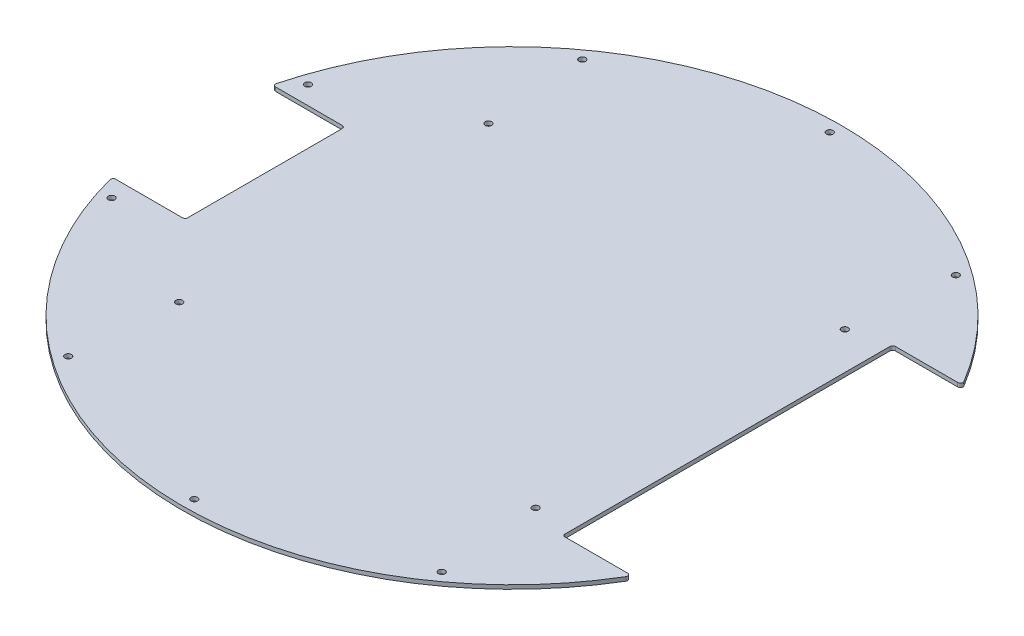
ISO-10303-21;
HEADER;
FILE_DESCRIPTION(('STEP AP214'),'2;1');
FILE_NAME('part.step','',(''),(''),'','','');
FILE_SCHEMA(('AUTOMOTIVE_DESIGN { 1 0 10303 214 1 1 1 1 }'));
ENDSEC;
DATA;
#1=APPLICATION_CONTEXT('core data for automotive mechanical design processes');
#2=APPLICATION_PROTOCOL_DEFINITION('international standard','automotive_design',2000,#1);
#3=PRODUCT_CONTEXT('',#1,'mechanical');
#4=PRODUCT('Part','Part','',(#3));
#5=PRODUCT_RELATED_PRODUCT_CATEGORY('part','',(#4));
#6=PRODUCT_DEFINITION_FORMATION('','',#4);
#7=PRODUCT_DEFINITION_CONTEXT('part definition',#1,'design');
#8=PRODUCT_DEFINITION('design','',#6,#7);
#9=PRODUCT_DEFINITION_SHAPE('','',#8);
#10=(LENGTH_UNIT() NAMED_UNIT(*) SI_UNIT(.MILLI.,.METRE.));
#11=(NAMED_UNIT(*) PLANE_ANGLE_UNIT() SI_UNIT($,.RADIAN.));
#12=(NAMED_UNIT(*) SI_UNIT($,.STERADIAN.) SOLID_ANGLE_UNIT());
#13=UNCERTAINTY_MEASURE_WITH_UNIT(LENGTH_MEASURE(1.E-05),#10,'distance_accuracy_value','');
#14=(GEOMETRIC_REPRESENTATION_CONTEXT(3) GLOBAL_UNCERTAINTY_ASSIGNED_CONTEXT((#13)) GLOBAL_UNIT_ASSIGNED_CONTEXT((#10,
#11,#12)) REPRESENTATION_CONTEXT('',''));
#15=CARTESIAN_POINT('',(0.,0.,0.));
#16=DIRECTION('',(0.,0.,1.));
#17=DIRECTION('',(1.,0.,0.));
#18=AXIS2_PLACEMENT_3D('',#15,#16,#17);
#19=CARTESIAN_POINT('',(0.,3.,0.));
#20=DIRECTION('',(0.,-1.,0.));
#21=DIRECTION('',(0.,0.,-1.));
#22=AXIS2_PLACEMENT_3D('',#19,#20,#21);
#23=CYLINDRICAL_SURFACE('',#22,251.5);
#24=CARTESIAN_POINT('',(0.,3.,0.));
#25=DIRECTION('',(0.,1.,0.));
#26=DIRECTION('',(0.,0.,1.));
#27=AXIS2_PLACEMENT_3D('',#24,#25,#26);
#28=CIRCLE('',#27,251.5);
#29=CARTESIAN_POINT('',(-243.350290121779,3.,63.5050100200451));
#30=VERTEX_POINT('',#29);
#31=CARTESIAN_POINT('',(215.880818690317,3.,129.026052104211));
#32=VERTEX_POINT('',#31);
#33=EDGE_CURVE('E151',#30,#32,#28,.T.);
#34=ORIENTED_EDGE('',*,*,#33,.F.);
#35=DIRECTION('',(0.,-1.,0.));
#36=VECTOR('',#35,1.);
#37=CARTESIAN_POINT('',(-243.350290121779,3.,63.5050100200451));
#38=LINE('',#37,#36);
#39=CARTESIAN_POINT('',(-243.350290121779,0.,63.5050100200451));
#40=VERTEX_POINT('',#39);
#41=EDGE_CURVE('E164',#30,#40,#38,.T.);
#42=ORIENTED_EDGE('',*,*,#41,.T.);
#43=CARTESIAN_POINT('',(0.,0.,0.));
#44=DIRECTION('',(0.,1.,0.));
#45=DIRECTION('',(0.,0.,1.));
#46=AXIS2_PLACEMENT_3D('',#43,#44,#45);
#47=CIRCLE('',#46,251.5);
#48=CARTESIAN_POINT('',(215.880818690317,0.,129.026052104211));
#49=VERTEX_POINT('',#48);
#50=EDGE_CURVE('E306',#40,#49,#47,.T.);
#51=ORIENTED_EDGE('',*,*,#50,.T.);
#52=DIRECTION('',(0.,-1.,0.));
#53=VECTOR('',#52,1.);
#54=CARTESIAN_POINT('',(215.880818690317,3.,129.026052104211));
#55=LINE('',#54,#53);
#56=EDGE_CURVE('E167',#49,#32,#55,.F.);
#57=ORIENTED_EDGE('',*,*,#56,.T.);
#58=EDGE_LOOP('',(#34,#42,#51,#57));
#59=FACE_BOUND('',#58,.T.);
#60=ADVANCED_FACE('F34',(#59),#23,.T.);
#61=CARTESIAN_POINT('',(215.880818690317,0.,-129.026052104211));
#62=VERTEX_POINT('',#61);
#63=CARTESIAN_POINT('',(-243.350290121782,0.,-63.5050100200349));
#64=VERTEX_POINT('',#63);
#65=EDGE_CURVE('E169',#62,#64,#47,.T.);
#66=ORIENTED_EDGE('',*,*,#65,.T.);
#67=DIRECTION('',(0.,-1.,0.));
#68=VECTOR('',#67,1.);
#69=CARTESIAN_POINT('',(-243.350290121782,3.,-63.5050100200349));
#70=LINE('',#69,#68);
#71=CARTESIAN_POINT('',(-243.350290121782,3.,-63.5050100200349));
#72=VERTEX_POINT('',#71);
#73=EDGE_CURVE('E196',#64,#72,#70,.F.);
#74=ORIENTED_EDGE('',*,*,#73,.T.);
#75=CARTESIAN_POINT('',(215.880818690317,3.,-129.026052104211));
#76=VERTEX_POINT('',#75);
#77=EDGE_CURVE('E168',#76,#72,#28,.T.);
#78=ORIENTED_EDGE('',*,*,#77,.F.);
#79=DIRECTION('',(0.,-1.,0.));
#80=VECTOR('',#79,1.);
#81=CARTESIAN_POINT('',(215.880818690317,3.,-129.026052104211));
#82=LINE('',#81,#80);
#83=EDGE_CURVE('E157',#76,#62,#82,.T.);
#84=ORIENTED_EDGE('',*,*,#83,.T.);
#85=EDGE_LOOP('',(#66,#74,#78,#84));
#86=FACE_BOUND('',#85,.T.);
#87=ADVANCED_FACE('F258',(#86),#23,.T.);
#88=CARTESIAN_POINT('',(0.,3.,0.));
#89=DIRECTION('',(0.,1.,0.));
#90=DIRECTION('',(0.,0.,1.));
#91=AXIS2_PLACEMENT_3D('',#88,#89,#90);
#92=PLANE('',#91);
#93=DIRECTION('',(1.,0.,0.));
#94=VECTOR('',#93,1.);
#95=CARTESIAN_POINT('',(-188.500000000003,3.,61.0000000000037));
#96=LINE('',#95,#94);
#97=CARTESIAN_POINT('',(-241.415098947848,3.,61.000000000005));
#98=VERTEX_POINT('',#97);
#99=CARTESIAN_POINT('',(-190.500000000003,3.,61.0000000000037));
#100=VERTEX_POINT('',#99);
#101=EDGE_CURVE('E153',#98,#100,#96,.T.);
#102=ORIENTED_EDGE('',*,*,#101,.F.);
#103=CARTESIAN_POINT('',(-241.415098947848,3.,63.000000000005));
#104=DIRECTION('',(0.,1.,0.));
#105=DIRECTION('',(0.,0.,1.));
#106=AXIS2_PLACEMENT_3D('',#103,#104,#105);
#107=CIRCLE('',#106,2.);
#108=EDGE_CURVE('E147',#98,#30,#107,.T.);
#109=ORIENTED_EDGE('',*,*,#108,.T.);
#110=ORIENTED_EDGE('',*,*,#33,.T.);
#111=CARTESIAN_POINT('',(214.164072617233,3.,128.000000000003));
#112=DIRECTION('',(0.,1.,0.));
#113=DIRECTION('',(0.,0.,1.));
#114=AXIS2_PLACEMENT_3D('',#111,#112,#113);
#115=CIRCLE('',#114,2.);
#116=CARTESIAN_POINT('',(214.164072617232,3.,126.000000000003));
#117=VERTEX_POINT('',#116);
#118=EDGE_CURVE('E191',#32,#117,#115,.T.);
#119=ORIENTED_EDGE('',*,*,#118,.T.);
#120=DIRECTION('',(1.,0.,0.));
#121=VECTOR('',#120,1.);
#122=CARTESIAN_POINT('',(164.499999999997,3.,126.000000000003));
#123=LINE('',#122,#121);
#124=CARTESIAN_POINT('',(166.499999999997,3.,126.000000000003));
#125=VERTEX_POINT('',#124);
#126=EDGE_CURVE('E367',#125,#117,#123,.T.);
#127=ORIENTED_EDGE('',*,*,#126,.F.);
#128=CARTESIAN_POINT('',(166.499999999997,3.,124.000000000003));
#129=DIRECTION('',(0.,1.,0.));
#130=DIRECTION('',(0.,0.,1.));
#131=AXIS2_PLACEMENT_3D('',#128,#129,#130);
#132=CIRCLE('',#131,2.);
#133=CARTESIAN_POINT('',(164.499999999997,3.,124.000000000003));
#134=VERTEX_POINT('',#133);
#135=EDGE_CURVE('E222',#125,#134,#132,.F.);
#136=ORIENTED_EDGE('',*,*,#135,.T.);
#137=DIRECTION('',(0.,0.,1.));
#138=VECTOR('',#137,1.);
#139=CARTESIAN_POINT('',(164.499999999997,3.,-126.000000000003));
#140=LINE('',#139,#138);
#141=CARTESIAN_POINT('',(164.499999999997,3.,-124.000000000003));
#142=VERTEX_POINT('',#141);
#143=EDGE_CURVE('E364',#142,#134,#140,.T.);
#144=ORIENTED_EDGE('',*,*,#143,.F.);
#145=CARTESIAN_POINT('',(166.499999999997,3.,-124.000000000003));
#146=DIRECTION('',(0.,1.,0.));
#147=DIRECTION('',(0.,0.,1.));
#148=AXIS2_PLACEMENT_3D('',#145,#146,#147);
#149=CIRCLE('',#148,2.);
#150=CARTESIAN_POINT('',(166.499999999997,3.,-126.000000000003));
#151=VERTEX_POINT('',#150);
#152=EDGE_CURVE('E226',#142,#151,#149,.F.);
#153=ORIENTED_EDGE('',*,*,#152,.T.);
#154=DIRECTION('',(-1.,0.,0.));
#155=VECTOR('',#154,1.);
#156=CARTESIAN_POINT('',(164.499999999997,3.,-126.000000000003));
#157=LINE('',#156,#155);
#158=CARTESIAN_POINT('',(214.164072617232,3.,-126.000000000003));
#159=VERTEX_POINT('',#158);
#160=EDGE_CURVE('E293',#159,#151,#157,.T.);
#161=ORIENTED_EDGE('',*,*,#160,.F.);
#162=CARTESIAN_POINT('',(214.164072617233,3.,-128.000000000003));
#163=DIRECTION('',(0.,1.,0.));
#164=DIRECTION('',(0.,0.,1.));
#165=AXIS2_PLACEMENT_3D('',#162,#163,#164);
#166=CIRCLE('',#165,2.);
#167=EDGE_CURVE('E189',#159,#76,#166,.T.);
#168=ORIENTED_EDGE('',*,*,#167,.T.);
#169=ORIENTED_EDGE('',*,*,#77,.T.);
#170=CARTESIAN_POINT('',(-241.415098947851,3.,-62.9999999999949));
#171=DIRECTION('',(0.,1.,0.));
#172=DIRECTION('',(0.,0.,1.));
#173=AXIS2_PLACEMENT_3D('',#170,#171,#172);
#174=CIRCLE('',#173,2.);
#175=CARTESIAN_POINT('',(-241.415098947851,3.,-60.9999999999949));
#176=VERTEX_POINT('',#175);
#177=EDGE_CURVE('E158',#72,#176,#174,.T.);
#178=ORIENTED_EDGE('',*,*,#177,.T.);
#179=DIRECTION('',(-1.,0.,0.));
#180=VECTOR('',#179,1.);
#181=CARTESIAN_POINT('',(-188.500000000003,3.,-60.9999999999962));
#182=LINE('',#181,#180);
#183=CARTESIAN_POINT('',(-190.500000000003,3.,-60.9999999999962));
#184=VERTEX_POINT('',#183);
#185=EDGE_CURVE('E357',#184,#176,#182,.T.);
#186=ORIENTED_EDGE('',*,*,#185,.F.);
#187=CARTESIAN_POINT('',(-190.500000000003,3.,-58.9999999999962));
#188=DIRECTION('',(0.,1.,0.));
#189=DIRECTION('',(0.,0.,1.));
#190=AXIS2_PLACEMENT_3D('',#187,#188,#189);
#191=CIRCLE('',#190,2.);
#192=CARTESIAN_POINT('',(-188.500000000003,3.,-58.9999999999962));
#193=VERTEX_POINT('',#192);
#194=EDGE_CURVE('E42',#184,#193,#191,.F.);
#195=ORIENTED_EDGE('',*,*,#194,.T.);
#196=DIRECTION('',(0.,0.,-1.));
#197=VECTOR('',#196,1.);
#198=CARTESIAN_POINT('',(-188.500000000003,3.,-60.9999999999962));
#199=LINE('',#198,#197);
#200=CARTESIAN_POINT('',(-188.500000000003,3.,59.0000000000037));
#201=VERTEX_POINT('',#200);
#202=EDGE_CURVE('E358',#201,#193,#199,.T.);
#203=ORIENTED_EDGE('',*,*,#202,.F.);
#204=CARTESIAN_POINT('',(-190.500000000003,3.,59.0000000000037));
#205=DIRECTION('',(0.,1.,0.));
#206=DIRECTION('',(0.,0.,1.));
#207=AXIS2_PLACEMENT_3D('',#204,#205,#206);
#208=CIRCLE('',#207,2.);
#209=EDGE_CURVE('E56',#201,#100,#208,.F.);
#210=ORIENTED_EDGE('',*,*,#209,.T.);
#211=EDGE_LOOP('',(#102,#109,#110,#119,#127,#136,#144,#153,#161,#168,#169,#178,#186,#195,#203,#210));
#212=FACE_BOUND('',#211,.T.);
#213=CARTESIAN_POINT('',(0.,3.,-242.5));
#214=DIRECTION('',(0.,1.,0.));
#215=DIRECTION('',(0.,0.,1.));
#216=AXIS2_PLACEMENT_3D('',#213,#214,#215);
#217=CIRCLE('',#216,2.5);
#218=CARTESIAN_POINT('',(0.,3.,-240.));
#219=VERTEX_POINT('',#218);
#220=EDGE_CURVE('E323',#219,#219,#217,.T.);
#221=ORIENTED_EDGE('',*,*,#220,.F.);
#222=EDGE_LOOP('',(#221));
#223=FACE_BOUND('',#222,.T.);
#224=CARTESIAN_POINT('',(-142.537923680923,3.,-196.186621135919));
#225=DIRECTION('',(0.,1.,0.));
#226=DIRECTION('',(0.,0.,1.));
#227=AXIS2_PLACEMENT_3D('',#224,#225,#226);
#228=CIRCLE('',#227,2.50000000000673);
#229=CARTESIAN_POINT('',(-142.537923680923,3.,-193.686621135912));
#230=VERTEX_POINT('',#229);
#231=EDGE_CURVE('E360',#230,#230,#228,.T.);
#232=ORIENTED_EDGE('',*,*,#231,.F.);
#233=EDGE_LOOP('',(#232));
#234=FACE_BOUND('',#233,.T.);
#235=CARTESIAN_POINT('',(-230.631205201568,3.,-74.9366211359149));
#236=DIRECTION('',(0.,1.,0.));
#237=DIRECTION('',(0.,0.,1.));
#238=AXIS2_PLACEMENT_3D('',#235,#236,#237);
#239=CIRCLE('',#238,2.50000000001235);
#240=CARTESIAN_POINT('',(-230.631205201568,3.,-72.4366211359026));
#241=VERTEX_POINT('',#240);
#242=EDGE_CURVE('E376',#241,#241,#239,.T.);
#243=ORIENTED_EDGE('',*,*,#242,.F.);
#244=EDGE_LOOP('',(#243));
#245=FACE_BOUND('',#244,.T.);
#246=CARTESIAN_POINT('',(-230.631205201561,3.,74.9366211359346));
#247=DIRECTION('',(0.,1.,0.));
#248=DIRECTION('',(0.,0.,1.));
#249=AXIS2_PLACEMENT_3D('',#246,#247,#248);
#250=CIRCLE('',#249,2.500000000018);
#251=CARTESIAN_POINT('',(-230.631205201561,3.,77.4366211359526));
#252=VERTEX_POINT('',#251);
#253=EDGE_CURVE('E388',#252,#252,#250,.T.);
#254=ORIENTED_EDGE('',*,*,#253,.F.);
#255=EDGE_LOOP('',(#254));
#256=FACE_BOUND('',#255,.T.);
#257=CARTESIAN_POINT('',(-142.537923680906,3.,196.186621135931));
#258=DIRECTION('',(0.,1.,0.));
#259=DIRECTION('',(0.,0.,1.));
#260=AXIS2_PLACEMENT_3D('',#257,#258,#259);
#261=CIRCLE('',#260,2.50000000002162);
#262=CARTESIAN_POINT('',(-142.537923680906,3.,198.686621135952));
#263=VERTEX_POINT('',#262);
#264=EDGE_CURVE('E385',#263,#263,#261,.T.);
#265=ORIENTED_EDGE('',*,*,#264,.F.);
#266=EDGE_LOOP('',(#265));
#267=FACE_BOUND('',#266,.T.);
#268=CARTESIAN_POINT('',(2.06173982408603E-11,3.,242.5));
#269=DIRECTION('',(0.,1.,0.));
#270=DIRECTION('',(0.,0.,1.));
#271=AXIS2_PLACEMENT_3D('',#268,#269,#270);
#272=CIRCLE('',#271,2.50000000002133);
#273=CARTESIAN_POINT('',(2.06173982408603E-11,3.,245.000000000021));
#274=VERTEX_POINT('',#273);
#275=EDGE_CURVE('E382',#274,#274,#272,.T.);
#276=ORIENTED_EDGE('',*,*,#275,.F.);
#277=EDGE_LOOP('',(#276));
#278=FACE_BOUND('',#277,.T.);
#279=CARTESIAN_POINT('',(142.537923680943,3.,196.186621135919));
#280=DIRECTION('',(0.,1.,0.));
#281=DIRECTION('',(0.,0.,1.));
#282=AXIS2_PLACEMENT_3D('',#279,#280,#281);
#283=CIRCLE('',#282,2.50000000001738);
#284=CARTESIAN_POINT('',(142.537923680943,3.,198.686621135936));
#285=VERTEX_POINT('',#284);
#286=EDGE_CURVE('E379',#285,#285,#283,.T.);
#287=ORIENTED_EDGE('',*,*,#286,.F.);
#288=EDGE_LOOP('',(#287));
#289=FACE_BOUND('',#288,.T.);
#290=CARTESIAN_POINT('',(142.537923680927,3.,-196.186621135931));
#291=DIRECTION('',(0.,1.,0.));
#292=DIRECTION('',(0.,0.,1.));
#293=AXIS2_PLACEMENT_3D('',#290,#291,#292);
#294=CIRCLE('',#293,2.50000000000042);
#295=CARTESIAN_POINT('',(142.537923680927,3.,-193.68662113593));
#296=VERTEX_POINT('',#295);
#297=EDGE_CURVE('E373',#296,#296,#294,.T.);
#298=ORIENTED_EDGE('',*,*,#297,.F.);
#299=EDGE_LOOP('',(#298));
#300=FACE_BOUND('',#299,.T.);
#301=CARTESIAN_POINT('',(-136.,3.,118.));
#302=DIRECTION('',(0.,1.,0.));
#303=DIRECTION('',(0.,0.,-1.));
#304=AXIS2_PLACEMENT_3D('',#301,#302,#303);
#305=CIRCLE('',#304,2.5);
#306=CARTESIAN_POINT('',(-136.,3.,115.5));
#307=VERTEX_POINT('',#306);
#308=EDGE_CURVE('E343',#307,#307,#305,.T.);
#309=ORIENTED_EDGE('',*,*,#308,.F.);
#310=EDGE_LOOP('',(#309));
#311=FACE_BOUND('',#310,.T.);
#312=CARTESIAN_POINT('',(136.,3.,118.));
#313=DIRECTION('',(0.,1.,0.));
#314=DIRECTION('',(0.,0.,1.));
#315=AXIS2_PLACEMENT_3D('',#312,#313,#314);
#316=CIRCLE('',#315,2.5);
#317=CARTESIAN_POINT('',(136.,3.,120.5));
#318=VERTEX_POINT('',#317);
#319=EDGE_CURVE('E396',#318,#318,#316,.T.);
#320=ORIENTED_EDGE('',*,*,#319,.F.);
#321=EDGE_LOOP('',(#320));
#322=FACE_BOUND('',#321,.T.);
#323=CARTESIAN_POINT('',(136.,3.,-118.));
#324=DIRECTION('',(0.,1.,0.));
#325=DIRECTION('',(0.,0.,-1.));
#326=AXIS2_PLACEMENT_3D('',#323,#324,#325);
#327=CIRCLE('',#326,2.5);
#328=CARTESIAN_POINT('',(136.,3.,-120.5));
#329=VERTEX_POINT('',#328);
#330=EDGE_CURVE('E393',#329,#329,#327,.T.);
#331=ORIENTED_EDGE('',*,*,#330,.F.);
#332=EDGE_LOOP('',(#331));
#333=FACE_BOUND('',#332,.T.);
#334=CARTESIAN_POINT('',(-136.,3.,-118.));
#335=DIRECTION('',(0.,1.,0.));
#336=DIRECTION('',(0.,0.,1.));
#337=AXIS2_PLACEMENT_3D('',#334,#335,#336);
#338=CIRCLE('',#337,2.5);
#339=CARTESIAN_POINT('',(-136.,3.,-115.5));
#340=VERTEX_POINT('',#339);
#341=EDGE_CURVE('E303',#340,#340,#338,.T.);
#342=ORIENTED_EDGE('',*,*,#341,.F.);
#343=EDGE_LOOP('',(#342));
#344=FACE_BOUND('',#343,.T.);
#345=ADVANCED_FACE('F149',(#212,#223,#234,#245,#256,#267,#278,#289,#300,#311,#322,#333,#344),
#92,.T.);
#346=CARTESIAN_POINT('',(0.,0.,0.));
#347=DIRECTION('',(0.,1.,0.));
#348=DIRECTION('',(0.,0.,1.));
#349=AXIS2_PLACEMENT_3D('',#346,#347,#348);
#350=PLANE('',#349);
#351=CARTESIAN_POINT('',(0.,0.,-242.5));
#352=DIRECTION('',(0.,1.,0.));
#353=DIRECTION('',(0.,0.,1.));
#354=AXIS2_PLACEMENT_3D('',#351,#352,#353);
#355=CIRCLE('',#354,2.5);
#356=CARTESIAN_POINT('',(0.,0.,-240.));
#357=VERTEX_POINT('',#356);
#358=EDGE_CURVE('E341',#357,#357,#355,.T.);
#359=ORIENTED_EDGE('',*,*,#358,.T.);
#360=EDGE_LOOP('',(#359));
#361=FACE_BOUND('',#360,.T.);
#362=CARTESIAN_POINT('',(-142.537923680923,0.,-196.186621135919));
#363=DIRECTION('',(0.,1.,0.));
#364=DIRECTION('',(0.,0.,1.));
#365=AXIS2_PLACEMENT_3D('',#362,#363,#364);
#366=CIRCLE('',#365,2.50000000000673);
#367=CARTESIAN_POINT('',(-142.537923680923,0.,-193.686621135912));
#368=VERTEX_POINT('',#367);
#369=EDGE_CURVE('E338',#368,#368,#366,.T.);
#370=ORIENTED_EDGE('',*,*,#369,.T.);
#371=EDGE_LOOP('',(#370));
#372=FACE_BOUND('',#371,.T.);
#373=CARTESIAN_POINT('',(-230.631205201568,0.,-74.9366211359149));
#374=DIRECTION('',(0.,1.,0.));
#375=DIRECTION('',(0.,0.,1.));
#376=AXIS2_PLACEMENT_3D('',#373,#374,#375);
#377=CIRCLE('',#376,2.50000000001235);
#378=CARTESIAN_POINT('',(-230.631205201568,0.,-72.4366211359026));
#379=VERTEX_POINT('',#378);
#380=EDGE_CURVE('E335',#379,#379,#377,.T.);
#381=ORIENTED_EDGE('',*,*,#380,.T.);
#382=EDGE_LOOP('',(#381));
#383=FACE_BOUND('',#382,.T.);
#384=CARTESIAN_POINT('',(-230.631205201561,0.,74.9366211359346));
#385=DIRECTION('',(0.,1.,0.));
#386=DIRECTION('',(0.,0.,1.));
#387=AXIS2_PLACEMENT_3D('',#384,#385,#386);
#388=CIRCLE('',#387,2.500000000018);
#389=CARTESIAN_POINT('',(-230.631205201561,0.,77.4366211359526));
#390=VERTEX_POINT('',#389);
#391=EDGE_CURVE('E332',#390,#390,#388,.T.);
#392=ORIENTED_EDGE('',*,*,#391,.T.);
#393=EDGE_LOOP('',(#392));
#394=FACE_BOUND('',#393,.T.);
#395=CARTESIAN_POINT('',(-142.537923680906,0.,196.186621135931));
#396=DIRECTION('',(0.,1.,0.));
#397=DIRECTION('',(0.,0.,1.));
#398=AXIS2_PLACEMENT_3D('',#395,#396,#397);
#399=CIRCLE('',#398,2.50000000002162);
#400=CARTESIAN_POINT('',(-142.537923680906,0.,198.686621135952));
#401=VERTEX_POINT('',#400);
#402=EDGE_CURVE('E329',#401,#401,#399,.T.);
#403=ORIENTED_EDGE('',*,*,#402,.T.);
#404=EDGE_LOOP('',(#403));
#405=FACE_BOUND('',#404,.T.);
#406=CARTESIAN_POINT('',(2.06173982408603E-11,0.,242.5));
#407=DIRECTION('',(0.,1.,0.));
#408=DIRECTION('',(0.,0.,1.));
#409=AXIS2_PLACEMENT_3D('',#406,#407,#408);
#410=CIRCLE('',#409,2.50000000002133);
#411=CARTESIAN_POINT('',(2.06173982408603E-11,0.,245.000000000021));
#412=VERTEX_POINT('',#411);
#413=EDGE_CURVE('E326',#412,#412,#410,.T.);
#414=ORIENTED_EDGE('',*,*,#413,.T.);
#415=EDGE_LOOP('',(#414));
#416=FACE_BOUND('',#415,.T.);
#417=CARTESIAN_POINT('',(142.537923680943,0.,196.186621135919));
#418=DIRECTION('',(0.,1.,0.));
#419=DIRECTION('',(0.,0.,1.));
#420=AXIS2_PLACEMENT_3D('',#417,#418,#419);
#421=CIRCLE('',#420,2.50000000001738);
#422=CARTESIAN_POINT('',(142.537923680943,0.,198.686621135936));
#423=VERTEX_POINT('',#422);
#424=EDGE_CURVE('E322',#423,#423,#421,.T.);
#425=ORIENTED_EDGE('',*,*,#424,.T.);
#426=EDGE_LOOP('',(#425));
#427=FACE_BOUND('',#426,.T.);
#428=CARTESIAN_POINT('',(142.537923680927,0.,-196.186621135931));
#429=DIRECTION('',(0.,1.,0.));
#430=DIRECTION('',(0.,0.,1.));
#431=AXIS2_PLACEMENT_3D('',#428,#429,#430);
#432=CIRCLE('',#431,2.50000000000042);
#433=CARTESIAN_POINT('',(142.537923680927,0.,-193.68662113593));
#434=VERTEX_POINT('',#433);
#435=EDGE_CURVE('E319',#434,#434,#432,.T.);
#436=ORIENTED_EDGE('',*,*,#435,.T.);
#437=EDGE_LOOP('',(#436));
#438=FACE_BOUND('',#437,.T.);
#439=CARTESIAN_POINT('',(-136.,0.,118.));
#440=DIRECTION('',(0.,1.,0.));
#441=DIRECTION('',(0.,0.,1.));
#442=AXIS2_PLACEMENT_3D('',#439,#440,#441);
#443=CIRCLE('',#442,2.5);
#444=CARTESIAN_POINT('',(-136.,0.,120.5));
#445=VERTEX_POINT('',#444);
#446=EDGE_CURVE('E316',#445,#445,#443,.T.);
#447=ORIENTED_EDGE('',*,*,#446,.T.);
#448=EDGE_LOOP('',(#447));
#449=FACE_BOUND('',#448,.T.);
#450=CARTESIAN_POINT('',(136.,0.,118.));
#451=DIRECTION('',(0.,1.,0.));
#452=DIRECTION('',(0.,0.,1.));
#453=AXIS2_PLACEMENT_3D('',#450,#451,#452);
#454=CIRCLE('',#453,2.5);
#455=CARTESIAN_POINT('',(136.,0.,120.5));
#456=VERTEX_POINT('',#455);
#457=EDGE_CURVE('E313',#456,#456,#454,.T.);
#458=ORIENTED_EDGE('',*,*,#457,.T.);
#459=EDGE_LOOP('',(#458));
#460=FACE_BOUND('',#459,.T.);
#461=CARTESIAN_POINT('',(136.,0.,-118.));
#462=DIRECTION('',(0.,1.,0.));
#463=DIRECTION('',(0.,0.,1.));
#464=AXIS2_PLACEMENT_3D('',#461,#462,#463);
#465=CIRCLE('',#464,2.5);
#466=CARTESIAN_POINT('',(136.,0.,-115.5));
#467=VERTEX_POINT('',#466);
#468=EDGE_CURVE('E310',#467,#467,#465,.T.);
#469=ORIENTED_EDGE('',*,*,#468,.T.);
#470=EDGE_LOOP('',(#469));
#471=FACE_BOUND('',#470,.T.);
#472=CARTESIAN_POINT('',(-136.,0.,-118.));
#473=DIRECTION('',(0.,1.,0.));
#474=DIRECTION('',(0.,0.,1.));
#475=AXIS2_PLACEMENT_3D('',#472,#473,#474);
#476=CIRCLE('',#475,2.5);
#477=CARTESIAN_POINT('',(-136.,0.,-115.5));
#478=VERTEX_POINT('',#477);
#479=EDGE_CURVE('E307',#478,#478,#476,.T.);
#480=ORIENTED_EDGE('',*,*,#479,.T.);
#481=EDGE_LOOP('',(#480));
#482=FACE_BOUND('',#481,.T.);
#483=ORIENTED_EDGE('',*,*,#50,.F.);
#484=CARTESIAN_POINT('',(-241.415098947848,0.,63.000000000005));
#485=DIRECTION('',(0.,1.,0.));
#486=DIRECTION('',(0.,0.,1.));
#487=AXIS2_PLACEMENT_3D('',#484,#485,#486);
#488=CIRCLE('',#487,2.);
#489=CARTESIAN_POINT('',(-241.415098947848,0.,61.000000000005));
#490=VERTEX_POINT('',#489);
#491=EDGE_CURVE('E172',#40,#490,#488,.F.);
#492=ORIENTED_EDGE('',*,*,#491,.T.);
#493=DIRECTION('',(1.,0.,0.));
#494=VECTOR('',#493,1.);
#495=CARTESIAN_POINT('',(1.52785920147927E-12,0.,60.9999999999989));
#496=LINE('',#495,#494);
#497=CARTESIAN_POINT('',(-190.500000000003,0.,61.0000000000037));
#498=VERTEX_POINT('',#497);
#499=EDGE_CURVE('E177',#490,#498,#496,.T.);
#500=ORIENTED_EDGE('',*,*,#499,.T.);
#501=CARTESIAN_POINT('',(-190.500000000003,0.,59.0000000000037));
#502=DIRECTION('',(0.,1.,0.));
#503=DIRECTION('',(0.,0.,1.));
#504=AXIS2_PLACEMENT_3D('',#501,#502,#503);
#505=CIRCLE('',#504,2.);
#506=CARTESIAN_POINT('',(-188.500000000003,0.,59.0000000000037));
#507=VERTEX_POINT('',#506);
#508=EDGE_CURVE('E231',#498,#507,#505,.T.);
#509=ORIENTED_EDGE('',*,*,#508,.T.);
#510=DIRECTION('',(0.,0.,-1.));
#511=VECTOR('',#510,1.);
#512=CARTESIAN_POINT('',(-188.500000000003,0.,0.));
#513=LINE('',#512,#511);
#514=CARTESIAN_POINT('',(-188.500000000003,0.,-58.9999999999962));
#515=VERTEX_POINT('',#514);
#516=EDGE_CURVE('E238',#507,#515,#513,.T.);
#517=ORIENTED_EDGE('',*,*,#516,.T.);
#518=CARTESIAN_POINT('',(-190.500000000003,0.,-58.9999999999962));
#519=DIRECTION('',(0.,1.,0.));
#520=DIRECTION('',(0.,0.,1.));
#521=AXIS2_PLACEMENT_3D('',#518,#519,#520);
#522=CIRCLE('',#521,2.);
#523=CARTESIAN_POINT('',(-190.500000000003,0.,-60.9999999999962));
#524=VERTEX_POINT('',#523);
#525=EDGE_CURVE('E11',#515,#524,#522,.T.);
#526=ORIENTED_EDGE('',*,*,#525,.T.);
#527=DIRECTION('',(-1.,0.,0.));
#528=VECTOR('',#527,1.);
#529=CARTESIAN_POINT('',(-1.52213688237266E-12,0.,-61.0000000000009));
#530=LINE('',#529,#528);
#531=CARTESIAN_POINT('',(-241.415098947851,0.,-60.9999999999949));
#532=VERTEX_POINT('',#531);
#533=EDGE_CURVE('E244',#524,#532,#530,.T.);
#534=ORIENTED_EDGE('',*,*,#533,.T.);
#535=CARTESIAN_POINT('',(-241.415098947851,0.,-62.9999999999949));
#536=DIRECTION('',(0.,1.,0.));
#537=DIRECTION('',(0.,0.,1.));
#538=AXIS2_PLACEMENT_3D('',#535,#536,#537);
#539=CIRCLE('',#538,2.);
#540=EDGE_CURVE('E182',#532,#64,#539,.F.);
#541=ORIENTED_EDGE('',*,*,#540,.T.);
#542=ORIENTED_EDGE('',*,*,#65,.F.);
#543=CARTESIAN_POINT('',(214.164072617233,0.,-128.000000000003));
#544=DIRECTION('',(0.,1.,0.));
#545=DIRECTION('',(0.,0.,1.));
#546=AXIS2_PLACEMENT_3D('',#543,#544,#545);
#547=CIRCLE('',#546,2.);
#548=CARTESIAN_POINT('',(214.164072617233,0.,-126.000000000003));
#549=VERTEX_POINT('',#548);
#550=EDGE_CURVE('E173',#62,#549,#547,.F.);
#551=ORIENTED_EDGE('',*,*,#550,.T.);
#552=DIRECTION('',(-1.,0.,0.));
#553=VECTOR('',#552,1.);
#554=CARTESIAN_POINT('',(0.,0.,-126.000000000003));
#555=LINE('',#554,#553);
#556=CARTESIAN_POINT('',(166.499999999997,0.,-126.000000000003));
#557=VERTEX_POINT('',#556);
#558=EDGE_CURVE('E347',#549,#557,#555,.T.);
#559=ORIENTED_EDGE('',*,*,#558,.T.);
#560=CARTESIAN_POINT('',(166.499999999997,0.,-124.000000000003));
#561=DIRECTION('',(0.,1.,0.));
#562=DIRECTION('',(0.,0.,1.));
#563=AXIS2_PLACEMENT_3D('',#560,#561,#562);
#564=CIRCLE('',#563,2.);
#565=CARTESIAN_POINT('',(164.499999999997,0.,-124.000000000003));
#566=VERTEX_POINT('',#565);
#567=EDGE_CURVE('E228',#557,#566,#564,.T.);
#568=ORIENTED_EDGE('',*,*,#567,.T.);
#569=DIRECTION('',(0.,0.,1.));
#570=VECTOR('',#569,1.);
#571=CARTESIAN_POINT('',(164.499999999997,0.,0.));
#572=LINE('',#571,#570);
#573=CARTESIAN_POINT('',(164.499999999997,0.,124.000000000003));
#574=VERTEX_POINT('',#573);
#575=EDGE_CURVE('E299',#566,#574,#572,.T.);
#576=ORIENTED_EDGE('',*,*,#575,.T.);
#577=CARTESIAN_POINT('',(166.499999999997,0.,124.000000000003));
#578=DIRECTION('',(0.,1.,0.));
#579=DIRECTION('',(0.,0.,1.));
#580=AXIS2_PLACEMENT_3D('',#577,#578,#579);
#581=CIRCLE('',#580,2.);
#582=CARTESIAN_POINT('',(166.499999999997,0.,126.000000000003));
#583=VERTEX_POINT('',#582);
#584=EDGE_CURVE('E224',#574,#583,#581,.T.);
#585=ORIENTED_EDGE('',*,*,#584,.T.);
#586=DIRECTION('',(1.,0.,0.));
#587=VECTOR('',#586,1.);
#588=CARTESIAN_POINT('',(0.,0.,126.000000000003));
#589=LINE('',#588,#587);
#590=CARTESIAN_POINT('',(214.164072617233,0.,126.000000000003));
#591=VERTEX_POINT('',#590);
#592=EDGE_CURVE('E297',#583,#591,#589,.T.);
#593=ORIENTED_EDGE('',*,*,#592,.T.);
#594=CARTESIAN_POINT('',(214.164072617233,0.,128.000000000003));
#595=DIRECTION('',(0.,1.,0.));
#596=DIRECTION('',(0.,0.,1.));
#597=AXIS2_PLACEMENT_3D('',#594,#595,#596);
#598=CIRCLE('',#597,2.);
#599=EDGE_CURVE('E175',#591,#49,#598,.F.);
#600=ORIENTED_EDGE('',*,*,#599,.T.);
#601=EDGE_LOOP('',(#483,#492,#500,#509,#517,#526,#534,#541,#542,#551,#559,#568,#576,#585,#593,#600));
#602=FACE_BOUND('',#601,.T.);
#603=ADVANCED_FACE('F237',(#361,#372,#383,#394,#405,#416,#427,#438,#449,#460,#471,#482,#602),
#350,.F.);
#604=CARTESIAN_POINT('',(-136.,-2.,-118.));
#605=DIRECTION('',(0.,1.,0.));
#606=DIRECTION('',(0.,0.,1.));
#607=AXIS2_PLACEMENT_3D('',#604,#605,#606);
#608=CYLINDRICAL_SURFACE('',#607,2.5);
#609=ORIENTED_EDGE('',*,*,#341,.T.);
#610=EDGE_LOOP('',(#609));
#611=FACE_BOUND('',#610,.T.);
#612=ORIENTED_EDGE('',*,*,#479,.F.);
#613=EDGE_LOOP('',(#612));
#614=FACE_BOUND('',#613,.T.);
#615=ADVANCED_FACE('F413',(#611,#614),#608,.F.);
#616=CARTESIAN_POINT('',(136.,-2.,-118.));
#617=DIRECTION('',(0.,1.,0.));
#618=DIRECTION('',(0.,0.,1.));
#619=AXIS2_PLACEMENT_3D('',#616,#617,#618);
#620=CYLINDRICAL_SURFACE('',#619,2.5);
#621=ORIENTED_EDGE('',*,*,#330,.T.);
#622=EDGE_LOOP('',(#621));
#623=FACE_BOUND('',#622,.T.);
#624=ORIENTED_EDGE('',*,*,#468,.F.);
#625=EDGE_LOOP('',(#624));
#626=FACE_BOUND('',#625,.T.);
#627=ADVANCED_FACE('F416',(#623,#626),#620,.F.);
#628=CARTESIAN_POINT('',(136.,-2.,118.));
#629=DIRECTION('',(0.,1.,0.));
#630=DIRECTION('',(0.,0.,1.));
#631=AXIS2_PLACEMENT_3D('',#628,#629,#630);
#632=CYLINDRICAL_SURFACE('',#631,2.5);
#633=ORIENTED_EDGE('',*,*,#319,.T.);
#634=EDGE_LOOP('',(#633));
#635=FACE_BOUND('',#634,.T.);
#636=ORIENTED_EDGE('',*,*,#457,.F.);
#637=EDGE_LOOP('',(#636));
#638=FACE_BOUND('',#637,.T.);
#639=ADVANCED_FACE('F447',(#635,#638),#632,.F.);
#640=CARTESIAN_POINT('',(-136.,-2.,118.));
#641=DIRECTION('',(0.,1.,0.));
#642=DIRECTION('',(0.,0.,1.));
#643=AXIS2_PLACEMENT_3D('',#640,#641,#642);
#644=CYLINDRICAL_SURFACE('',#643,2.5);
#645=ORIENTED_EDGE('',*,*,#308,.T.);
#646=EDGE_LOOP('',(#645));
#647=FACE_BOUND('',#646,.T.);
#648=ORIENTED_EDGE('',*,*,#446,.F.);
#649=EDGE_LOOP('',(#648));
#650=FACE_BOUND('',#649,.T.);
#651=ADVANCED_FACE('F401',(#647,#650),#644,.F.);
#652=CARTESIAN_POINT('',(142.537923680927,-2.,-196.186621135931));
#653=DIRECTION('',(0.,1.,0.));
#654=DIRECTION('',(0.,0.,1.));
#655=AXIS2_PLACEMENT_3D('',#652,#653,#654);
#656=CYLINDRICAL_SURFACE('',#655,2.50000000000042);
#657=ORIENTED_EDGE('',*,*,#297,.T.);
#658=EDGE_LOOP('',(#657));
#659=FACE_BOUND('',#658,.T.);
#660=ORIENTED_EDGE('',*,*,#435,.F.);
#661=EDGE_LOOP('',(#660));
#662=FACE_BOUND('',#661,.T.);
#663=ADVANCED_FACE('F460',(#659,#662),#656,.F.);
#664=CARTESIAN_POINT('',(142.537923680943,-2.,196.186621135919));
#665=DIRECTION('',(0.,1.,0.));
#666=DIRECTION('',(0.,0.,1.));
#667=AXIS2_PLACEMENT_3D('',#664,#665,#666);
#668=CYLINDRICAL_SURFACE('',#667,2.50000000001738);
#669=ORIENTED_EDGE('',*,*,#286,.T.);
#670=EDGE_LOOP('',(#669));
#671=FACE_BOUND('',#670,.T.);
#672=ORIENTED_EDGE('',*,*,#424,.F.);
#673=EDGE_LOOP('',(#672));
#674=FACE_BOUND('',#673,.T.);
#675=ADVANCED_FACE('F464',(#671,#674),#668,.F.);
#676=CARTESIAN_POINT('',(2.06173982408603E-11,-2.,242.5));
#677=DIRECTION('',(0.,1.,0.));
#678=DIRECTION('',(0.,0.,1.));
#679=AXIS2_PLACEMENT_3D('',#676,#677,#678);
#680=CYLINDRICAL_SURFACE('',#679,2.50000000002133);
#681=ORIENTED_EDGE('',*,*,#275,.T.);
#682=EDGE_LOOP('',(#681));
#683=FACE_BOUND('',#682,.T.);
#684=ORIENTED_EDGE('',*,*,#413,.F.);
#685=EDGE_LOOP('',(#684));
#686=FACE_BOUND('',#685,.T.);
#687=ADVANCED_FACE('F470',(#683,#686),#680,.F.);
#688=CARTESIAN_POINT('',(-142.537923680906,-2.,196.186621135931));
#689=DIRECTION('',(0.,1.,0.));
#690=DIRECTION('',(0.,0.,1.));
#691=AXIS2_PLACEMENT_3D('',#688,#689,#690);
#692=CYLINDRICAL_SURFACE('',#691,2.50000000002162);
#693=ORIENTED_EDGE('',*,*,#264,.T.);
#694=EDGE_LOOP('',(#693));
#695=FACE_BOUND('',#694,.T.);
#696=ORIENTED_EDGE('',*,*,#402,.F.);
#697=EDGE_LOOP('',(#696));
#698=FACE_BOUND('',#697,.T.);
#699=ADVANCED_FACE('F480',(#695,#698),#692,.F.);
#700=CARTESIAN_POINT('',(-230.631205201561,-2.,74.9366211359346));
#701=DIRECTION('',(0.,1.,0.));
#702=DIRECTION('',(0.,0.,1.));
#703=AXIS2_PLACEMENT_3D('',#700,#701,#702);
#704=CYLINDRICAL_SURFACE('',#703,2.500000000018);
#705=ORIENTED_EDGE('',*,*,#253,.T.);
#706=EDGE_LOOP('',(#705));
#707=FACE_BOUND('',#706,.T.);
#708=ORIENTED_EDGE('',*,*,#391,.F.);
#709=EDGE_LOOP('',(#708));
#710=FACE_BOUND('',#709,.T.);
#711=ADVANCED_FACE('F483',(#707,#710),#704,.F.);
#712=CARTESIAN_POINT('',(-230.631205201568,-2.,-74.9366211359149));
#713=DIRECTION('',(0.,1.,0.));
#714=DIRECTION('',(0.,0.,1.));
#715=AXIS2_PLACEMENT_3D('',#712,#713,#714);
#716=CYLINDRICAL_SURFACE('',#715,2.50000000001235);
#717=ORIENTED_EDGE('',*,*,#242,.T.);
#718=EDGE_LOOP('',(#717));
#719=FACE_BOUND('',#718,.T.);
#720=ORIENTED_EDGE('',*,*,#380,.F.);
#721=EDGE_LOOP('',(#720));
#722=FACE_BOUND('',#721,.T.);
#723=ADVANCED_FACE('F456',(#719,#722),#716,.F.);
#724=CARTESIAN_POINT('',(-142.537923680923,-2.,-196.186621135919));
#725=DIRECTION('',(0.,1.,0.));
#726=DIRECTION('',(0.,0.,1.));
#727=AXIS2_PLACEMENT_3D('',#724,#725,#726);
#728=CYLINDRICAL_SURFACE('',#727,2.50000000000673);
#729=ORIENTED_EDGE('',*,*,#231,.T.);
#730=EDGE_LOOP('',(#729));
#731=FACE_BOUND('',#730,.T.);
#732=ORIENTED_EDGE('',*,*,#369,.F.);
#733=EDGE_LOOP('',(#732));
#734=FACE_BOUND('',#733,.T.);
#735=ADVANCED_FACE('F475',(#731,#734),#728,.F.);
#736=CARTESIAN_POINT('',(0.,-2.,-242.5));
#737=DIRECTION('',(0.,1.,0.));
#738=DIRECTION('',(0.,0.,1.));
#739=AXIS2_PLACEMENT_3D('',#736,#737,#738);
#740=CYLINDRICAL_SURFACE('',#739,2.5);
#741=ORIENTED_EDGE('',*,*,#220,.T.);
#742=EDGE_LOOP('',(#741));
#743=FACE_BOUND('',#742,.T.);
#744=ORIENTED_EDGE('',*,*,#358,.F.);
#745=EDGE_LOOP('',(#744));
#746=FACE_BOUND('',#745,.T.);
#747=ADVANCED_FACE('F508',(#743,#746),#740,.F.);
#748=CARTESIAN_POINT('',(164.499999999997,-7.,-126.000000000003));
#749=DIRECTION('',(-1.,0.,0.));
#750=DIRECTION('',(0.,0.,1.));
#751=AXIS2_PLACEMENT_3D('',#748,#749,#750);
#752=PLANE('',#751);
#753=ORIENTED_EDGE('',*,*,#143,.T.);
#754=DIRECTION('',(0.,1.,0.));
#755=VECTOR('',#754,1.);
#756=CARTESIAN_POINT('',(164.499999999997,0.,124.000000000003));
#757=LINE('',#756,#755);
#758=EDGE_CURVE('E212',#134,#574,#757,.F.);
#759=ORIENTED_EDGE('',*,*,#758,.T.);
#760=ORIENTED_EDGE('',*,*,#575,.F.);
#761=DIRECTION('',(0.,1.,0.));
#762=VECTOR('',#761,1.);
#763=CARTESIAN_POINT('',(164.499999999997,3.,-124.000000000003));
#764=LINE('',#763,#762);
#765=EDGE_CURVE('E209',#566,#142,#764,.T.);
#766=ORIENTED_EDGE('',*,*,#765,.T.);
#767=EDGE_LOOP('',(#753,#759,#760,#766));
#768=FACE_BOUND('',#767,.T.);
#769=ADVANCED_FACE('F516',(#768),#752,.F.);
#770=CARTESIAN_POINT('',(164.499999999997,-7.,-126.000000000003));
#771=DIRECTION('',(0.,0.,-1.));
#772=DIRECTION('',(-1.,0.,0.));
#773=AXIS2_PLACEMENT_3D('',#770,#771,#772);
#774=PLANE('',#773);
#775=ORIENTED_EDGE('',*,*,#558,.F.);
#776=DIRECTION('',(0.,-1.,0.));
#777=VECTOR('',#776,1.);
#778=CARTESIAN_POINT('',(214.164072617233,-7.,-126.000000000003));
#779=LINE('',#778,#777);
#780=EDGE_CURVE('E216',#549,#159,#779,.F.);
#781=ORIENTED_EDGE('',*,*,#780,.T.);
#782=ORIENTED_EDGE('',*,*,#160,.T.);
#783=DIRECTION('',(0.,1.,0.));
#784=VECTOR('',#783,1.);
#785=CARTESIAN_POINT('',(166.499999999997,0.,-126.000000000003));
#786=LINE('',#785,#784);
#787=EDGE_CURVE('E214',#151,#557,#786,.F.);
#788=ORIENTED_EDGE('',*,*,#787,.T.);
#789=EDGE_LOOP('',(#775,#781,#782,#788));
#790=FACE_BOUND('',#789,.T.);
#791=ADVANCED_FACE('F524',(#790),#774,.F.);
#792=CARTESIAN_POINT('',(164.499999999997,-7.,126.000000000003));
#793=DIRECTION('',(0.,0.,1.));
#794=DIRECTION('',(1.,0.,0.));
#795=AXIS2_PLACEMENT_3D('',#792,#793,#794);
#796=PLANE('',#795);
#797=ORIENTED_EDGE('',*,*,#126,.T.);
#798=DIRECTION('',(0.,-1.,0.));
#799=VECTOR('',#798,1.);
#800=CARTESIAN_POINT('',(214.164072617233,-7.,126.000000000003));
#801=LINE('',#800,#799);
#802=EDGE_CURVE('E207',#117,#591,#801,.T.);
#803=ORIENTED_EDGE('',*,*,#802,.T.);
#804=ORIENTED_EDGE('',*,*,#592,.F.);
#805=DIRECTION('',(0.,1.,0.));
#806=VECTOR('',#805,1.);
#807=CARTESIAN_POINT('',(166.499999999997,3.,126.000000000003));
#808=LINE('',#807,#806);
#809=EDGE_CURVE('E204',#583,#125,#808,.T.);
#810=ORIENTED_EDGE('',*,*,#809,.T.);
#811=EDGE_LOOP('',(#797,#803,#804,#810));
#812=FACE_BOUND('',#811,.T.);
#813=ADVANCED_FACE('F529',(#812),#796,.F.);
#814=CARTESIAN_POINT('',(-188.500000000003,-7.,-60.9999999999962));
#815=DIRECTION('',(1.,0.,0.));
#816=DIRECTION('',(0.,0.,-1.));
#817=AXIS2_PLACEMENT_3D('',#814,#815,#816);
#818=PLANE('',#817);
#819=ORIENTED_EDGE('',*,*,#516,.F.);
#820=DIRECTION('',(0.,1.,0.));
#821=VECTOR('',#820,1.);
#822=CARTESIAN_POINT('',(-188.500000000003,3.,59.0000000000037));
#823=LINE('',#822,#821);
#824=EDGE_CURVE('E220',#507,#201,#823,.T.);
#825=ORIENTED_EDGE('',*,*,#824,.T.);
#826=ORIENTED_EDGE('',*,*,#202,.T.);
#827=DIRECTION('',(0.,1.,0.));
#828=VECTOR('',#827,1.);
#829=CARTESIAN_POINT('',(-188.500000000003,0.,-58.9999999999962));
#830=LINE('',#829,#828);
#831=EDGE_CURVE('E218',#193,#515,#830,.F.);
#832=ORIENTED_EDGE('',*,*,#831,.T.);
#833=EDGE_LOOP('',(#819,#825,#826,#832));
#834=FACE_BOUND('',#833,.T.);
#835=ADVANCED_FACE('F242',(#834),#818,.F.);
#836=CARTESIAN_POINT('',(-188.500000000003,-7.,61.0000000000037));
#837=DIRECTION('',(0.,0.,1.));
#838=DIRECTION('',(1.,0.,0.));
#839=AXIS2_PLACEMENT_3D('',#836,#837,#838);
#840=PLANE('',#839);
#841=ORIENTED_EDGE('',*,*,#499,.F.);
#842=DIRECTION('',(0.,-1.,0.));
#843=VECTOR('',#842,1.);
#844=CARTESIAN_POINT('',(-241.415098947848,-7.,61.000000000005));
#845=LINE('',#844,#843);
#846=EDGE_CURVE('E187',#490,#98,#845,.F.);
#847=ORIENTED_EDGE('',*,*,#846,.T.);
#848=ORIENTED_EDGE('',*,*,#101,.T.);
#849=DIRECTION('',(0.,1.,0.));
#850=VECTOR('',#849,1.);
#851=CARTESIAN_POINT('',(-190.500000000003,0.,61.0000000000037));
#852=LINE('',#851,#850);
#853=EDGE_CURVE('E185',#100,#498,#852,.F.);
#854=ORIENTED_EDGE('',*,*,#853,.T.);
#855=EDGE_LOOP('',(#841,#847,#848,#854));
#856=FACE_BOUND('',#855,.T.);
#857=ADVANCED_FACE('F538',(#856),#840,.F.);
#858=CARTESIAN_POINT('',(-188.500000000003,-7.,-60.9999999999962));
#859=DIRECTION('',(0.,0.,-1.));
#860=DIRECTION('',(-1.,0.,0.));
#861=AXIS2_PLACEMENT_3D('',#858,#859,#860);
#862=PLANE('',#861);
#863=ORIENTED_EDGE('',*,*,#185,.T.);
#864=DIRECTION('',(0.,-1.,0.));
#865=VECTOR('',#864,1.);
#866=CARTESIAN_POINT('',(-241.415098947851,-7.,-60.9999999999949));
#867=LINE('',#866,#865);
#868=EDGE_CURVE('E202',#176,#532,#867,.T.);
#869=ORIENTED_EDGE('',*,*,#868,.T.);
#870=ORIENTED_EDGE('',*,*,#533,.F.);
#871=DIRECTION('',(0.,1.,0.));
#872=VECTOR('',#871,1.);
#873=CARTESIAN_POINT('',(-190.500000000003,3.,-60.9999999999962));
#874=LINE('',#873,#872);
#875=EDGE_CURVE('E199',#524,#184,#874,.T.);
#876=ORIENTED_EDGE('',*,*,#875,.T.);
#877=EDGE_LOOP('',(#863,#869,#870,#876));
#878=FACE_BOUND('',#877,.T.);
#879=ADVANCED_FACE('F270',(#878),#862,.F.);
#880=CARTESIAN_POINT('',(-241.415098947848,3.,63.000000000005));
#881=DIRECTION('',(0.,-1.,0.));
#882=DIRECTION('',(0.,0.,-1.));
#883=AXIS2_PLACEMENT_3D('',#880,#881,#882);
#884=CYLINDRICAL_SURFACE('',#883,2.);
#885=ORIENTED_EDGE('',*,*,#108,.F.);
#886=ORIENTED_EDGE('',*,*,#846,.F.);
#887=ORIENTED_EDGE('',*,*,#491,.F.);
#888=ORIENTED_EDGE('',*,*,#41,.F.);
#889=EDGE_LOOP('',(#885,#886,#887,#888));
#890=FACE_BOUND('',#889,.T.);
#891=ADVANCED_FACE('F171',(#890),#884,.T.);
#892=CARTESIAN_POINT('',(-241.415098947851,3.,-62.9999999999949));
#893=DIRECTION('',(0.,-1.,0.));
#894=DIRECTION('',(0.,0.,-1.));
#895=AXIS2_PLACEMENT_3D('',#892,#893,#894);
#896=CYLINDRICAL_SURFACE('',#895,2.);
#897=ORIENTED_EDGE('',*,*,#540,.F.);
#898=ORIENTED_EDGE('',*,*,#868,.F.);
#899=ORIENTED_EDGE('',*,*,#177,.F.);
#900=ORIENTED_EDGE('',*,*,#73,.F.);
#901=EDGE_LOOP('',(#897,#898,#899,#900));
#902=FACE_BOUND('',#901,.T.);
#903=ADVANCED_FACE('F269',(#902),#896,.T.);
#904=CARTESIAN_POINT('',(214.164072617233,3.,128.000000000003));
#905=DIRECTION('',(0.,-1.,0.));
#906=DIRECTION('',(0.,0.,-1.));
#907=AXIS2_PLACEMENT_3D('',#904,#905,#906);
#908=CYLINDRICAL_SURFACE('',#907,2.);
#909=ORIENTED_EDGE('',*,*,#599,.F.);
#910=ORIENTED_EDGE('',*,*,#802,.F.);
#911=ORIENTED_EDGE('',*,*,#118,.F.);
#912=ORIENTED_EDGE('',*,*,#56,.F.);
#913=EDGE_LOOP('',(#909,#910,#911,#912));
#914=FACE_BOUND('',#913,.T.);
#915=ADVANCED_FACE('F273',(#914),#908,.T.);
#916=CARTESIAN_POINT('',(166.499999999997,-7.,124.000000000003));
#917=DIRECTION('',(0.,-1.,0.));
#918=DIRECTION('',(0.,0.,-1.));
#919=AXIS2_PLACEMENT_3D('',#916,#917,#918);
#920=CYLINDRICAL_SURFACE('',#919,2.);
#921=ORIENTED_EDGE('',*,*,#584,.F.);
#922=ORIENTED_EDGE('',*,*,#758,.F.);
#923=ORIENTED_EDGE('',*,*,#135,.F.);
#924=ORIENTED_EDGE('',*,*,#809,.F.);
#925=EDGE_LOOP('',(#921,#922,#923,#924));
#926=FACE_BOUND('',#925,.T.);
#927=ADVANCED_FACE('F277',(#926),#920,.F.);
#928=CARTESIAN_POINT('',(214.164072617233,3.,-128.000000000003));
#929=DIRECTION('',(0.,-1.,0.));
#930=DIRECTION('',(0.,0.,-1.));
#931=AXIS2_PLACEMENT_3D('',#928,#929,#930);
#932=CYLINDRICAL_SURFACE('',#931,2.);
#933=ORIENTED_EDGE('',*,*,#167,.F.);
#934=ORIENTED_EDGE('',*,*,#780,.F.);
#935=ORIENTED_EDGE('',*,*,#550,.F.);
#936=ORIENTED_EDGE('',*,*,#83,.F.);
#937=EDGE_LOOP('',(#933,#934,#935,#936));
#938=FACE_BOUND('',#937,.T.);
#939=ADVANCED_FACE('F254',(#938),#932,.T.);
#940=CARTESIAN_POINT('',(166.499999999997,-7.,-124.000000000003));
#941=DIRECTION('',(0.,-1.,0.));
#942=DIRECTION('',(0.,0.,-1.));
#943=AXIS2_PLACEMENT_3D('',#940,#941,#942);
#944=CYLINDRICAL_SURFACE('',#943,2.);
#945=ORIENTED_EDGE('',*,*,#567,.F.);
#946=ORIENTED_EDGE('',*,*,#787,.F.);
#947=ORIENTED_EDGE('',*,*,#152,.F.);
#948=ORIENTED_EDGE('',*,*,#765,.F.);
#949=EDGE_LOOP('',(#945,#946,#947,#948));
#950=FACE_BOUND('',#949,.T.);
#951=ADVANCED_FACE('F248',(#950),#944,.F.);
#952=CARTESIAN_POINT('',(-190.500000000003,-7.,59.0000000000037));
#953=DIRECTION('',(0.,-1.,0.));
#954=DIRECTION('',(0.,0.,-1.));
#955=AXIS2_PLACEMENT_3D('',#952,#953,#954);
#956=CYLINDRICAL_SURFACE('',#955,2.);
#957=ORIENTED_EDGE('',*,*,#508,.F.);
#958=ORIENTED_EDGE('',*,*,#853,.F.);
#959=ORIENTED_EDGE('',*,*,#209,.F.);
#960=ORIENTED_EDGE('',*,*,#824,.F.);
#961=EDGE_LOOP('',(#957,#958,#959,#960));
#962=FACE_BOUND('',#961,.T.);
#963=ADVANCED_FACE('F246',(#962),#956,.F.);
#964=CARTESIAN_POINT('',(-190.500000000003,-7.,-58.9999999999962));
#965=DIRECTION('',(0.,-1.,0.));
#966=DIRECTION('',(0.,0.,-1.));
#967=AXIS2_PLACEMENT_3D('',#964,#965,#966);
#968=CYLINDRICAL_SURFACE('',#967,2.);
#969=ORIENTED_EDGE('',*,*,#525,.F.);
#970=ORIENTED_EDGE('',*,*,#831,.F.);
#971=ORIENTED_EDGE('',*,*,#194,.F.);
#972=ORIENTED_EDGE('',*,*,#875,.F.);
#973=EDGE_LOOP('',(#969,#970,#971,#972));
#974=FACE_BOUND('',#973,.T.);
#975=ADVANCED_FACE('F36',(#974),#968,.F.);
#976=CLOSED_SHELL('',(#60,#87,#345,#603,#615,#627,#639,#651,#663,#675,#687,#699,#711,#723,#735,
#747,#769,#791,#813,#835,#857,#879,#891,#903,#915,#927,#939,#951,#963,#975));
#977=MANIFOLD_SOLID_BREP('B2',#976);
#978=ADVANCED_BREP_SHAPE_REPRESENTATION('',(#18,#977),#14);
#979=SHAPE_DEFINITION_REPRESENTATION(#9,#978);
ENDSEC;
END-ISO-10303-21;
